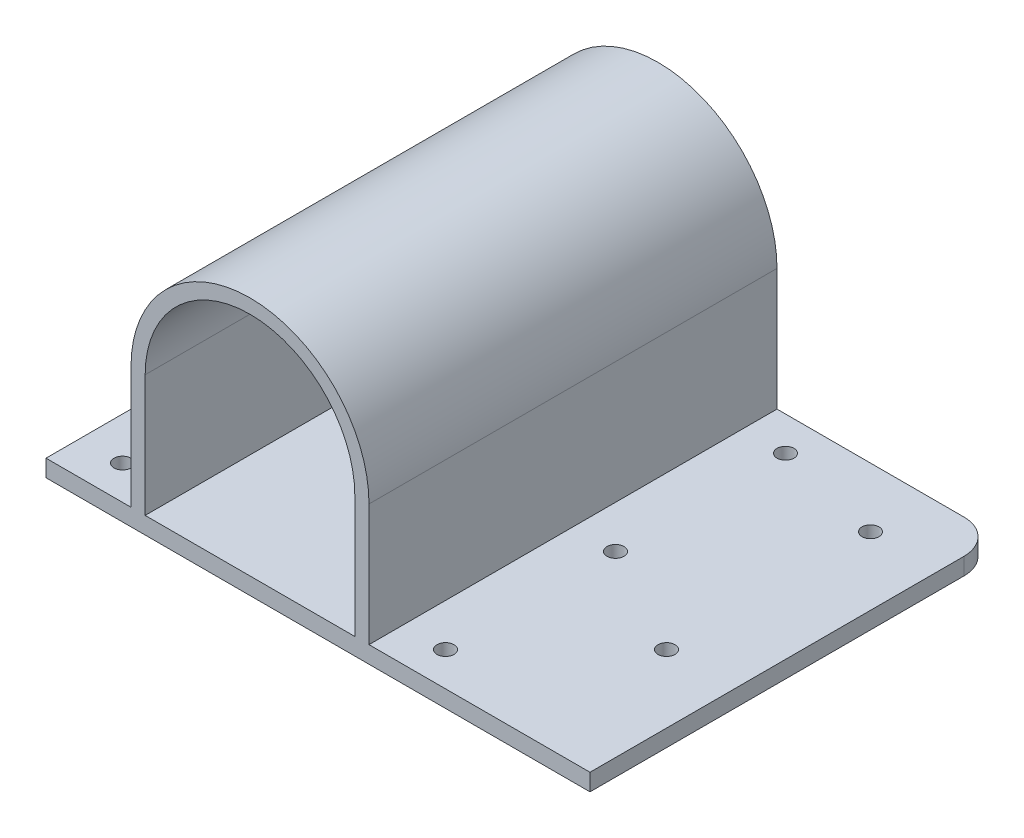
ISO-10303-21;
HEADER;
FILE_DESCRIPTION(('STEP AP214'),'2;1');
FILE_NAME('part.step','',(''),(''),'','','');
FILE_SCHEMA(('AUTOMOTIVE_DESIGN { 1 0 10303 214 1 1 1 1 }'));
ENDSEC;
DATA;
#1=APPLICATION_CONTEXT('core data for automotive mechanical design processes');
#2=APPLICATION_PROTOCOL_DEFINITION('international standard','automotive_design',2000,#1);
#3=PRODUCT_CONTEXT('',#1,'mechanical');
#4=PRODUCT('Part','Part','',(#3));
#5=PRODUCT_RELATED_PRODUCT_CATEGORY('part','',(#4));
#6=PRODUCT_DEFINITION_FORMATION('','',#4);
#7=PRODUCT_DEFINITION_CONTEXT('part definition',#1,'design');
#8=PRODUCT_DEFINITION('design','',#6,#7);
#9=PRODUCT_DEFINITION_SHAPE('','',#8);
#10=(LENGTH_UNIT() NAMED_UNIT(*) SI_UNIT(.MILLI.,.METRE.));
#11=(NAMED_UNIT(*) PLANE_ANGLE_UNIT() SI_UNIT($,.RADIAN.));
#12=(NAMED_UNIT(*) SI_UNIT($,.STERADIAN.) SOLID_ANGLE_UNIT());
#13=UNCERTAINTY_MEASURE_WITH_UNIT(LENGTH_MEASURE(1.E-05),#10,'distance_accuracy_value','');
#14=(GEOMETRIC_REPRESENTATION_CONTEXT(3) GLOBAL_UNCERTAINTY_ASSIGNED_CONTEXT((#13)) GLOBAL_UNIT_ASSIGNED_CONTEXT((#10,
#11,#12)) REPRESENTATION_CONTEXT('',''));
#15=CARTESIAN_POINT('',(0.,0.,0.));
#16=DIRECTION('',(0.,0.,1.));
#17=DIRECTION('',(1.,0.,0.));
#18=AXIS2_PLACEMENT_3D('',#15,#16,#17);
#19=CARTESIAN_POINT('',(0.,15.5,72.));
#20=DIRECTION('',(0.,0.,-1.));
#21=DIRECTION('',(-1.,0.,0.));
#22=AXIS2_PLACEMENT_3D('',#19,#20,#21);
#23=CYLINDRICAL_SURFACE('',#22,1.65);
#24=CARTESIAN_POINT('',(0.,15.5,0.));
#25=DIRECTION('',(0.,0.,1.));
#26=DIRECTION('',(1.,0.,0.));
#27=AXIS2_PLACEMENT_3D('',#24,#25,#26);
#28=CIRCLE('',#27,1.65);
#29=CARTESIAN_POINT('',(1.64999999999994,15.5,0.));
#30=VERTEX_POINT('',#29);
#31=EDGE_CURVE('E270',#30,#30,#28,.T.);
#32=ORIENTED_EDGE('',*,*,#31,.F.);
#33=EDGE_LOOP('',(#32));
#34=FACE_BOUND('',#33,.T.);
#35=CARTESIAN_POINT('',(0.,15.5,15.));
#36=DIRECTION('',(0.,0.,1.));
#37=DIRECTION('',(1.,0.,0.));
#38=AXIS2_PLACEMENT_3D('',#35,#36,#37);
#39=CIRCLE('',#38,1.65);
#40=CARTESIAN_POINT('',(1.64999999999994,15.5,15.));
#41=VERTEX_POINT('',#40);
#42=EDGE_CURVE('E249',#41,#41,#39,.T.);
#43=ORIENTED_EDGE('',*,*,#42,.T.);
#44=EDGE_LOOP('',(#43));
#45=FACE_BOUND('',#44,.T.);
#46=ADVANCED_FACE('F39',(#34,#45),#23,.F.);
#47=CARTESIAN_POINT('',(7.,0.,72.));
#48=DIRECTION('',(0.,0.,-1.));
#49=DIRECTION('',(-1.,0.,0.));
#50=AXIS2_PLACEMENT_3D('',#47,#48,#49);
#51=CYLINDRICAL_SURFACE('',#50,6.15);
#52=CARTESIAN_POINT('',(7.,0.,0.));
#53=DIRECTION('',(0.,0.,1.));
#54=DIRECTION('',(1.,0.,0.));
#55=AXIS2_PLACEMENT_3D('',#52,#53,#54);
#56=CIRCLE('',#55,6.15);
#57=CARTESIAN_POINT('',(13.15,0.,0.));
#58=VERTEX_POINT('',#57);
#59=EDGE_CURVE('E267',#58,#58,#56,.T.);
#60=ORIENTED_EDGE('',*,*,#59,.F.);
#61=EDGE_LOOP('',(#60));
#62=FACE_BOUND('',#61,.T.);
#63=CARTESIAN_POINT('',(7.,0.,15.));
#64=DIRECTION('',(0.,0.,1.));
#65=DIRECTION('',(1.,0.,0.));
#66=AXIS2_PLACEMENT_3D('',#63,#64,#65);
#67=CIRCLE('',#66,6.15);
#68=CARTESIAN_POINT('',(13.15,0.,15.));
#69=VERTEX_POINT('',#68);
#70=EDGE_CURVE('E246',#69,#69,#67,.T.);
#71=ORIENTED_EDGE('',*,*,#70,.T.);
#72=EDGE_LOOP('',(#71));
#73=FACE_BOUND('',#72,.T.);
#74=ADVANCED_FACE('F356',(#62,#73),#51,.F.);
#75=CARTESIAN_POINT('',(13.4233937586588,7.75000000000005,72.));
#76=DIRECTION('',(0.,0.,-1.));
#77=DIRECTION('',(-1.,0.,0.));
#78=AXIS2_PLACEMENT_3D('',#75,#76,#77);
#79=CYLINDRICAL_SURFACE('',#78,1.65);
#80=CARTESIAN_POINT('',(13.4233937586588,7.75000000000005,0.));
#81=DIRECTION('',(0.,0.,1.));
#82=DIRECTION('',(1.,0.,0.));
#83=AXIS2_PLACEMENT_3D('',#80,#81,#82);
#84=CIRCLE('',#83,1.65);
#85=CARTESIAN_POINT('',(15.0733937586588,7.75000000000005,0.));
#86=VERTEX_POINT('',#85);
#87=EDGE_CURVE('E264',#86,#86,#84,.T.);
#88=ORIENTED_EDGE('',*,*,#87,.F.);
#89=EDGE_LOOP('',(#88));
#90=FACE_BOUND('',#89,.T.);
#91=CARTESIAN_POINT('',(13.4233937586588,7.75000000000005,15.));
#92=DIRECTION('',(0.,0.,1.));
#93=DIRECTION('',(1.,0.,0.));
#94=AXIS2_PLACEMENT_3D('',#91,#92,#93);
#95=CIRCLE('',#94,1.65);
#96=CARTESIAN_POINT('',(15.0733937586588,7.75000000000005,15.));
#97=VERTEX_POINT('',#96);
#98=EDGE_CURVE('E243',#97,#97,#95,.T.);
#99=ORIENTED_EDGE('',*,*,#98,.T.);
#100=EDGE_LOOP('',(#99));
#101=FACE_BOUND('',#100,.T.);
#102=ADVANCED_FACE('F363',(#90,#101),#79,.F.);
#103=CARTESIAN_POINT('',(13.4233937586588,-7.74999999999995,72.));
#104=DIRECTION('',(0.,0.,-1.));
#105=DIRECTION('',(-1.,0.,0.));
#106=AXIS2_PLACEMENT_3D('',#103,#104,#105);
#107=CYLINDRICAL_SURFACE('',#106,1.65);
#108=CARTESIAN_POINT('',(13.4233937586588,-7.74999999999995,0.));
#109=DIRECTION('',(0.,0.,1.));
#110=DIRECTION('',(1.,0.,0.));
#111=AXIS2_PLACEMENT_3D('',#108,#109,#110);
#112=CIRCLE('',#111,1.65);
#113=CARTESIAN_POINT('',(15.0733937586588,-7.74999999999995,0.));
#114=VERTEX_POINT('',#113);
#115=EDGE_CURVE('E261',#114,#114,#112,.T.);
#116=ORIENTED_EDGE('',*,*,#115,.F.);
#117=EDGE_LOOP('',(#116));
#118=FACE_BOUND('',#117,.T.);
#119=CARTESIAN_POINT('',(13.4233937586588,-7.74999999999995,15.));
#120=DIRECTION('',(0.,0.,1.));
#121=DIRECTION('',(1.,0.,0.));
#122=AXIS2_PLACEMENT_3D('',#119,#120,#121);
#123=CIRCLE('',#122,1.65);
#124=CARTESIAN_POINT('',(15.0733937586588,-7.74999999999995,15.));
#125=VERTEX_POINT('',#124);
#126=EDGE_CURVE('E240',#125,#125,#123,.T.);
#127=ORIENTED_EDGE('',*,*,#126,.T.);
#128=EDGE_LOOP('',(#127));
#129=FACE_BOUND('',#128,.T.);
#130=ADVANCED_FACE('F444',(#118,#129),#107,.F.);
#131=CARTESIAN_POINT('',(0.,-15.5,72.));
#132=DIRECTION('',(0.,0.,-1.));
#133=DIRECTION('',(-1.,0.,0.));
#134=AXIS2_PLACEMENT_3D('',#131,#132,#133);
#135=CYLINDRICAL_SURFACE('',#134,1.65);
#136=CARTESIAN_POINT('',(0.,-15.5,0.));
#137=DIRECTION('',(0.,0.,1.));
#138=DIRECTION('',(1.,0.,0.));
#139=AXIS2_PLACEMENT_3D('',#136,#137,#138);
#140=CIRCLE('',#139,1.65);
#141=CARTESIAN_POINT('',(1.65000000000006,-15.5,0.));
#142=VERTEX_POINT('',#141);
#143=EDGE_CURVE('E258',#142,#142,#140,.T.);
#144=ORIENTED_EDGE('',*,*,#143,.F.);
#145=EDGE_LOOP('',(#144));
#146=FACE_BOUND('',#145,.T.);
#147=CARTESIAN_POINT('',(0.,-15.5,15.));
#148=DIRECTION('',(0.,0.,1.));
#149=DIRECTION('',(1.,0.,0.));
#150=AXIS2_PLACEMENT_3D('',#147,#148,#149);
#151=CIRCLE('',#150,1.65);
#152=CARTESIAN_POINT('',(1.65000000000006,-15.5,15.));
#153=VERTEX_POINT('',#152);
#154=EDGE_CURVE('E237',#153,#153,#151,.T.);
#155=ORIENTED_EDGE('',*,*,#154,.T.);
#156=EDGE_LOOP('',(#155));
#157=FACE_BOUND('',#156,.T.);
#158=ADVANCED_FACE('F435',(#146,#157),#135,.F.);
#159=CARTESIAN_POINT('',(-13.4233937586588,-7.75000000000006,72.));
#160=DIRECTION('',(0.,0.,-1.));
#161=DIRECTION('',(-1.,0.,0.));
#162=AXIS2_PLACEMENT_3D('',#159,#160,#161);
#163=CYLINDRICAL_SURFACE('',#162,1.65);
#164=CARTESIAN_POINT('',(-13.4233937586588,-7.75000000000006,0.));
#165=DIRECTION('',(0.,0.,1.));
#166=DIRECTION('',(1.,0.,0.));
#167=AXIS2_PLACEMENT_3D('',#164,#165,#166);
#168=CIRCLE('',#167,1.65);
#169=CARTESIAN_POINT('',(-11.7733937586588,-7.75000000000006,0.));
#170=VERTEX_POINT('',#169);
#171=EDGE_CURVE('E255',#170,#170,#168,.T.);
#172=ORIENTED_EDGE('',*,*,#171,.F.);
#173=EDGE_LOOP('',(#172));
#174=FACE_BOUND('',#173,.T.);
#175=CARTESIAN_POINT('',(-13.4233937586588,-7.75000000000006,15.));
#176=DIRECTION('',(0.,0.,1.));
#177=DIRECTION('',(1.,0.,0.));
#178=AXIS2_PLACEMENT_3D('',#175,#176,#177);
#179=CIRCLE('',#178,1.65);
#180=CARTESIAN_POINT('',(-11.7733937586588,-7.75000000000006,15.));
#181=VERTEX_POINT('',#180);
#182=EDGE_CURVE('E234',#181,#181,#179,.T.);
#183=ORIENTED_EDGE('',*,*,#182,.T.);
#184=EDGE_LOOP('',(#183));
#185=FACE_BOUND('',#184,.T.);
#186=ADVANCED_FACE('F426',(#174,#185),#163,.F.);
#187=CARTESIAN_POINT('',(-13.4233937586588,7.74999999999995,72.));
#188=DIRECTION('',(0.,0.,-1.));
#189=DIRECTION('',(-1.,0.,0.));
#190=AXIS2_PLACEMENT_3D('',#187,#188,#189);
#191=CYLINDRICAL_SURFACE('',#190,1.65);
#192=CARTESIAN_POINT('',(-13.4233937586588,7.74999999999995,0.));
#193=DIRECTION('',(0.,0.,1.));
#194=DIRECTION('',(1.,0.,0.));
#195=AXIS2_PLACEMENT_3D('',#192,#193,#194);
#196=CIRCLE('',#195,1.65);
#197=CARTESIAN_POINT('',(-11.7733937586588,7.74999999999995,0.));
#198=VERTEX_POINT('',#197);
#199=EDGE_CURVE('E252',#198,#198,#196,.T.);
#200=ORIENTED_EDGE('',*,*,#199,.F.);
#201=EDGE_LOOP('',(#200));
#202=FACE_BOUND('',#201,.T.);
#203=CARTESIAN_POINT('',(-13.4233937586588,7.74999999999995,15.));
#204=DIRECTION('',(0.,0.,1.));
#205=DIRECTION('',(1.,0.,0.));
#206=AXIS2_PLACEMENT_3D('',#203,#204,#205);
#207=CIRCLE('',#206,1.65);
#208=CARTESIAN_POINT('',(-11.7733937586588,7.74999999999995,15.));
#209=VERTEX_POINT('',#208);
#210=EDGE_CURVE('E227',#209,#209,#207,.T.);
#211=ORIENTED_EDGE('',*,*,#210,.T.);
#212=EDGE_LOOP('',(#211));
#213=FACE_BOUND('',#212,.T.);
#214=ADVANCED_FACE('F372',(#202,#213),#191,.F.);
#215=CARTESIAN_POINT('',(0.,0.,72.));
#216=DIRECTION('',(0.,0.,1.));
#217=DIRECTION('',(1.,0.,0.));
#218=AXIS2_PLACEMENT_3D('',#215,#216,#217);
#219=PLANE('',#218);
#220=CARTESIAN_POINT('',(0.,0.,72.));
#221=DIRECTION('',(0.,0.,1.));
#222=DIRECTION('',(1.,0.,0.));
#223=AXIS2_PLACEMENT_3D('',#220,#221,#222);
#224=CIRCLE('',#223,18.5);
#225=CARTESIAN_POINT('',(18.5,0.,72.));
#226=VERTEX_POINT('',#225);
#227=CARTESIAN_POINT('',(-18.5,0.,72.));
#228=VERTEX_POINT('',#227);
#229=EDGE_CURVE('E199',#226,#228,#224,.T.);
#230=ORIENTED_EDGE('',*,*,#229,.F.);
#231=DIRECTION('',(0.,1.,0.));
#232=VECTOR('',#231,1.);
#233=CARTESIAN_POINT('',(18.5,-21.5,72.));
#234=LINE('',#233,#232);
#235=CARTESIAN_POINT('',(18.5,-21.5,72.));
#236=VERTEX_POINT('',#235);
#237=EDGE_CURVE('E206',#236,#226,#234,.T.);
#238=ORIENTED_EDGE('',*,*,#237,.F.);
#239=DIRECTION('',(1.,0.,0.));
#240=VECTOR('',#239,1.);
#241=CARTESIAN_POINT('',(-18.5,-21.5,72.));
#242=LINE('',#241,#240);
#243=CARTESIAN_POINT('',(-18.5,-21.5,72.));
#244=VERTEX_POINT('',#243);
#245=EDGE_CURVE('E220',#244,#236,#242,.T.);
#246=ORIENTED_EDGE('',*,*,#245,.F.);
#247=DIRECTION('',(0.,-1.,0.));
#248=VECTOR('',#247,1.);
#249=CARTESIAN_POINT('',(-18.5,0.,72.));
#250=LINE('',#249,#248);
#251=EDGE_CURVE('E217',#228,#244,#250,.T.);
#252=ORIENTED_EDGE('',*,*,#251,.F.);
#253=EDGE_LOOP('',(#230,#238,#246,#252));
#254=FACE_BOUND('',#253,.T.);
#255=CARTESIAN_POINT('',(0.,0.,72.));
#256=DIRECTION('',(0.,0.,1.));
#257=DIRECTION('',(1.,0.,0.));
#258=AXIS2_PLACEMENT_3D('',#255,#256,#257);
#259=CIRCLE('',#258,21.);
#260=CARTESIAN_POINT('',(21.,0.,72.));
#261=VERTEX_POINT('',#260);
#262=CARTESIAN_POINT('',(-21.,0.,72.));
#263=VERTEX_POINT('',#262);
#264=EDGE_CURVE('E274',#261,#263,#259,.T.);
#265=ORIENTED_EDGE('',*,*,#264,.T.);
#266=DIRECTION('',(0.,-1.,0.));
#267=VECTOR('',#266,1.);
#268=CARTESIAN_POINT('',(-21.,0.,72.));
#269=LINE('',#268,#267);
#270=CARTESIAN_POINT('',(-21.,-21.5,72.));
#271=VERTEX_POINT('',#270);
#272=EDGE_CURVE('E276',#263,#271,#269,.T.);
#273=ORIENTED_EDGE('',*,*,#272,.T.);
#274=DIRECTION('',(-1.,0.,0.));
#275=VECTOR('',#274,1.);
#276=CARTESIAN_POINT('',(-21.,-21.5,72.));
#277=LINE('',#276,#275);
#278=CARTESIAN_POINT('',(-36.,-21.5,72.));
#279=VERTEX_POINT('',#278);
#280=EDGE_CURVE('E279',#271,#279,#277,.T.);
#281=ORIENTED_EDGE('',*,*,#280,.T.);
#282=DIRECTION('',(0.,-1.,0.));
#283=VECTOR('',#282,1.);
#284=CARTESIAN_POINT('',(-36.,-21.5,72.));
#285=LINE('',#284,#283);
#286=CARTESIAN_POINT('',(-36.,-24.5,72.));
#287=VERTEX_POINT('',#286);
#288=EDGE_CURVE('E140',#279,#287,#285,.T.);
#289=ORIENTED_EDGE('',*,*,#288,.T.);
#290=DIRECTION('',(1.,0.,0.));
#291=VECTOR('',#290,1.);
#292=CARTESIAN_POINT('',(-36.,-24.5,72.));
#293=LINE('',#292,#291);
#294=CARTESIAN_POINT('',(60.,-24.5,72.));
#295=VERTEX_POINT('',#294);
#296=EDGE_CURVE('E133',#287,#295,#293,.T.);
#297=ORIENTED_EDGE('',*,*,#296,.T.);
#298=DIRECTION('',(0.,1.,0.));
#299=VECTOR('',#298,1.);
#300=CARTESIAN_POINT('',(60.,-24.5,72.));
#301=LINE('',#300,#299);
#302=CARTESIAN_POINT('',(60.,-21.5,72.));
#303=VERTEX_POINT('',#302);
#304=EDGE_CURVE('E137',#295,#303,#301,.T.);
#305=ORIENTED_EDGE('',*,*,#304,.T.);
#306=DIRECTION('',(-1.,0.,0.));
#307=VECTOR('',#306,1.);
#308=CARTESIAN_POINT('',(36.,-21.5,72.));
#309=LINE('',#308,#307);
#310=CARTESIAN_POINT('',(21.,-21.5,72.));
#311=VERTEX_POINT('',#310);
#312=EDGE_CURVE('E145',#303,#311,#309,.T.);
#313=ORIENTED_EDGE('',*,*,#312,.T.);
#314=DIRECTION('',(0.,1.,0.));
#315=VECTOR('',#314,1.);
#316=CARTESIAN_POINT('',(21.,-21.5,72.));
#317=LINE('',#316,#315);
#318=EDGE_CURVE('E283',#311,#261,#317,.T.);
#319=ORIENTED_EDGE('',*,*,#318,.T.);
#320=EDGE_LOOP('',(#265,#273,#281,#289,#297,#305,#313,#319));
#321=FACE_BOUND('',#320,.T.);
#322=ADVANCED_FACE('F136',(#254,#321),#219,.T.);
#323=CARTESIAN_POINT('',(0.,0.,0.));
#324=DIRECTION('',(0.,0.,1.));
#325=DIRECTION('',(1.,0.,0.));
#326=AXIS2_PLACEMENT_3D('',#323,#324,#325);
#327=PLANE('',#326);
#328=DIRECTION('',(-1.,0.,0.));
#329=VECTOR('',#328,1.);
#330=CARTESIAN_POINT('',(36.,-21.5,0.));
#331=LINE('',#330,#329);
#332=CARTESIAN_POINT('',(54.,-21.5,0.));
#333=VERTEX_POINT('',#332);
#334=CARTESIAN_POINT('',(21.,-21.5,0.));
#335=VERTEX_POINT('',#334);
#336=EDGE_CURVE('E296',#333,#335,#331,.T.);
#337=ORIENTED_EDGE('',*,*,#336,.F.);
#338=DIRECTION('',(0.,1.,0.));
#339=VECTOR('',#338,1.);
#340=CARTESIAN_POINT('',(54.,-24.5,0.));
#341=LINE('',#340,#339);
#342=CARTESIAN_POINT('',(54.,-24.5,0.));
#343=VERTEX_POINT('',#342);
#344=EDGE_CURVE('E47',#333,#343,#341,.F.);
#345=ORIENTED_EDGE('',*,*,#344,.T.);
#346=DIRECTION('',(1.,0.,0.));
#347=VECTOR('',#346,1.);
#348=CARTESIAN_POINT('',(-36.,-24.5,0.));
#349=LINE('',#348,#347);
#350=CARTESIAN_POINT('',(-36.,-24.5,0.));
#351=VERTEX_POINT('',#350);
#352=EDGE_CURVE('E294',#351,#343,#349,.T.);
#353=ORIENTED_EDGE('',*,*,#352,.F.);
#354=DIRECTION('',(0.,-1.,0.));
#355=VECTOR('',#354,1.);
#356=CARTESIAN_POINT('',(-36.,-21.5,0.));
#357=LINE('',#356,#355);
#358=CARTESIAN_POINT('',(-36.,-21.5,0.));
#359=VERTEX_POINT('',#358);
#360=EDGE_CURVE('E292',#359,#351,#357,.T.);
#361=ORIENTED_EDGE('',*,*,#360,.F.);
#362=DIRECTION('',(-1.,0.,0.));
#363=VECTOR('',#362,1.);
#364=CARTESIAN_POINT('',(-21.,-21.5,0.));
#365=LINE('',#364,#363);
#366=CARTESIAN_POINT('',(-21.,-21.5,0.));
#367=VERTEX_POINT('',#366);
#368=EDGE_CURVE('E290',#367,#359,#365,.T.);
#369=ORIENTED_EDGE('',*,*,#368,.F.);
#370=DIRECTION('',(0.,-1.,0.));
#371=VECTOR('',#370,1.);
#372=CARTESIAN_POINT('',(-21.,0.,0.));
#373=LINE('',#372,#371);
#374=CARTESIAN_POINT('',(-21.,0.,0.));
#375=VERTEX_POINT('',#374);
#376=EDGE_CURVE('E288',#375,#367,#373,.T.);
#377=ORIENTED_EDGE('',*,*,#376,.F.);
#378=CARTESIAN_POINT('',(0.,0.,0.));
#379=DIRECTION('',(0.,0.,1.));
#380=DIRECTION('',(1.,0.,0.));
#381=AXIS2_PLACEMENT_3D('',#378,#379,#380);
#382=CIRCLE('',#381,21.);
#383=CARTESIAN_POINT('',(21.,0.,0.));
#384=VERTEX_POINT('',#383);
#385=EDGE_CURVE('E273',#384,#375,#382,.T.);
#386=ORIENTED_EDGE('',*,*,#385,.F.);
#387=DIRECTION('',(0.,1.,0.));
#388=VECTOR('',#387,1.);
#389=CARTESIAN_POINT('',(21.,-21.5,0.));
#390=LINE('',#389,#388);
#391=EDGE_CURVE('E277',#335,#384,#390,.T.);
#392=ORIENTED_EDGE('',*,*,#391,.F.);
#393=EDGE_LOOP('',(#337,#345,#353,#361,#369,#377,#386,#392));
#394=FACE_BOUND('',#393,.T.);
#395=ORIENTED_EDGE('',*,*,#31,.T.);
#396=EDGE_LOOP('',(#395));
#397=FACE_BOUND('',#396,.T.);
#398=ORIENTED_EDGE('',*,*,#59,.T.);
#399=EDGE_LOOP('',(#398));
#400=FACE_BOUND('',#399,.T.);
#401=ORIENTED_EDGE('',*,*,#87,.T.);
#402=EDGE_LOOP('',(#401));
#403=FACE_BOUND('',#402,.T.);
#404=ORIENTED_EDGE('',*,*,#115,.T.);
#405=EDGE_LOOP('',(#404));
#406=FACE_BOUND('',#405,.T.);
#407=ORIENTED_EDGE('',*,*,#143,.T.);
#408=EDGE_LOOP('',(#407));
#409=FACE_BOUND('',#408,.T.);
#410=ORIENTED_EDGE('',*,*,#171,.T.);
#411=EDGE_LOOP('',(#410));
#412=FACE_BOUND('',#411,.T.);
#413=ORIENTED_EDGE('',*,*,#199,.T.);
#414=EDGE_LOOP('',(#413));
#415=FACE_BOUND('',#414,.T.);
#416=ADVANCED_FACE('F344',(#394,#397,#400,#403,#406,#409,#412,#415),#327,.F.);
#417=CARTESIAN_POINT('',(0.,0.,72.));
#418=DIRECTION('',(0.,0.,-1.));
#419=DIRECTION('',(-1.,0.,0.));
#420=AXIS2_PLACEMENT_3D('',#417,#418,#419);
#421=CYLINDRICAL_SURFACE('',#420,21.);
#422=ORIENTED_EDGE('',*,*,#385,.T.);
#423=DIRECTION('',(0.,0.,-1.));
#424=VECTOR('',#423,1.);
#425=CARTESIAN_POINT('',(-21.,0.,72.));
#426=LINE('',#425,#424);
#427=EDGE_CURVE('E312',#263,#375,#426,.T.);
#428=ORIENTED_EDGE('',*,*,#427,.F.);
#429=ORIENTED_EDGE('',*,*,#264,.F.);
#430=DIRECTION('',(0.,0.,-1.));
#431=VECTOR('',#430,1.);
#432=CARTESIAN_POINT('',(21.,0.,72.));
#433=LINE('',#432,#431);
#434=EDGE_CURVE('E285',#261,#384,#433,.T.);
#435=ORIENTED_EDGE('',*,*,#434,.T.);
#436=EDGE_LOOP('',(#422,#428,#429,#435));
#437=FACE_BOUND('',#436,.T.);
#438=ADVANCED_FACE('F332',(#437),#421,.T.);
#439=CARTESIAN_POINT('',(-21.,0.,72.));
#440=DIRECTION('',(1.,0.,0.));
#441=DIRECTION('',(0.,1.,0.));
#442=AXIS2_PLACEMENT_3D('',#439,#440,#441);
#443=PLANE('',#442);
#444=ORIENTED_EDGE('',*,*,#376,.T.);
#445=DIRECTION('',(0.,0.,-1.));
#446=VECTOR('',#445,1.);
#447=CARTESIAN_POINT('',(-21.,-21.5,72.));
#448=LINE('',#447,#446);
#449=EDGE_CURVE('E309',#271,#367,#448,.T.);
#450=ORIENTED_EDGE('',*,*,#449,.F.);
#451=ORIENTED_EDGE('',*,*,#272,.F.);
#452=ORIENTED_EDGE('',*,*,#427,.T.);
#453=EDGE_LOOP('',(#444,#450,#451,#452));
#454=FACE_BOUND('',#453,.T.);
#455=ADVANCED_FACE('F334',(#454),#443,.F.);
#456=CARTESIAN_POINT('',(-21.,-21.5,72.));
#457=DIRECTION('',(0.,-1.,0.));
#458=DIRECTION('',(0.,0.,-1.));
#459=AXIS2_PLACEMENT_3D('',#456,#457,#458);
#460=PLANE('',#459);
#461=CARTESIAN_POINT('',(-28.5,-21.5,6.));
#462=DIRECTION('',(0.,1.,0.));
#463=DIRECTION('',(0.,0.,1.));
#464=AXIS2_PLACEMENT_3D('',#461,#462,#463);
#465=CIRCLE('',#464,1.5);
#466=CARTESIAN_POINT('',(-28.5,-21.5,7.5));
#467=VERTEX_POINT('',#466);
#468=EDGE_CURVE('E172',#467,#467,#465,.T.);
#469=ORIENTED_EDGE('',*,*,#468,.F.);
#470=EDGE_LOOP('',(#469));
#471=FACE_BOUND('',#470,.T.);
#472=CARTESIAN_POINT('',(-28.5,-21.5,66.));
#473=DIRECTION('',(0.,1.,0.));
#474=DIRECTION('',(0.,0.,1.));
#475=AXIS2_PLACEMENT_3D('',#472,#473,#474);
#476=CIRCLE('',#475,1.5);
#477=CARTESIAN_POINT('',(-28.5,-21.5,67.5));
#478=VERTEX_POINT('',#477);
#479=EDGE_CURVE('E179',#478,#478,#476,.T.);
#480=ORIENTED_EDGE('',*,*,#479,.F.);
#481=EDGE_LOOP('',(#480));
#482=FACE_BOUND('',#481,.T.);
#483=CARTESIAN_POINT('',(-28.5,-21.5,36.));
#484=DIRECTION('',(0.,1.,0.));
#485=DIRECTION('',(0.,0.,1.));
#486=AXIS2_PLACEMENT_3D('',#483,#484,#485);
#487=CIRCLE('',#486,1.5);
#488=CARTESIAN_POINT('',(-28.5,-21.5,37.5));
#489=VERTEX_POINT('',#488);
#490=EDGE_CURVE('E175',#489,#489,#487,.T.);
#491=ORIENTED_EDGE('',*,*,#490,.F.);
#492=EDGE_LOOP('',(#491));
#493=FACE_BOUND('',#492,.T.);
#494=ORIENTED_EDGE('',*,*,#368,.T.);
#495=DIRECTION('',(0.,0.,-1.));
#496=VECTOR('',#495,1.);
#497=CARTESIAN_POINT('',(-36.,-21.5,72.));
#498=LINE('',#497,#496);
#499=EDGE_CURVE('E306',#279,#359,#498,.T.);
#500=ORIENTED_EDGE('',*,*,#499,.F.);
#501=ORIENTED_EDGE('',*,*,#280,.F.);
#502=ORIENTED_EDGE('',*,*,#449,.T.);
#503=EDGE_LOOP('',(#494,#500,#501,#502));
#504=FACE_BOUND('',#503,.T.);
#505=ADVANCED_FACE('F339',(#471,#482,#493,#504),#460,.F.);
#506=CARTESIAN_POINT('',(-36.,-21.5,72.));
#507=DIRECTION('',(1.,0.,0.));
#508=DIRECTION('',(0.,0.,-1.));
#509=AXIS2_PLACEMENT_3D('',#506,#507,#508);
#510=PLANE('',#509);
#511=ORIENTED_EDGE('',*,*,#360,.T.);
#512=DIRECTION('',(0.,0.,-1.));
#513=VECTOR('',#512,1.);
#514=CARTESIAN_POINT('',(-36.,-24.5,72.));
#515=LINE('',#514,#513);
#516=EDGE_CURVE('E304',#287,#351,#515,.T.);
#517=ORIENTED_EDGE('',*,*,#516,.F.);
#518=ORIENTED_EDGE('',*,*,#288,.F.);
#519=ORIENTED_EDGE('',*,*,#499,.T.);
#520=EDGE_LOOP('',(#511,#517,#518,#519));
#521=FACE_BOUND('',#520,.T.);
#522=ADVANCED_FACE('F343',(#521),#510,.F.);
#523=CARTESIAN_POINT('',(-36.,-24.5,72.));
#524=DIRECTION('',(0.,1.,0.));
#525=DIRECTION('',(0.,0.,1.));
#526=AXIS2_PLACEMENT_3D('',#523,#524,#525);
#527=PLANE('',#526);
#528=CARTESIAN_POINT('',(-28.5,-24.5,6.));
#529=DIRECTION('',(0.,1.,0.));
#530=DIRECTION('',(0.,0.,1.));
#531=AXIS2_PLACEMENT_3D('',#528,#529,#530);
#532=CIRCLE('',#531,1.5);
#533=CARTESIAN_POINT('',(-28.5,-24.5,7.5));
#534=VERTEX_POINT('',#533);
#535=EDGE_CURVE('E176',#534,#534,#532,.T.);
#536=ORIENTED_EDGE('',*,*,#535,.T.);
#537=EDGE_LOOP('',(#536));
#538=FACE_BOUND('',#537,.T.);
#539=CARTESIAN_POINT('',(-28.5,-24.5,66.));
#540=DIRECTION('',(0.,1.,0.));
#541=DIRECTION('',(0.,0.,1.));
#542=AXIS2_PLACEMENT_3D('',#539,#540,#541);
#543=CIRCLE('',#542,1.5);
#544=CARTESIAN_POINT('',(-28.5,-24.5,67.5));
#545=VERTEX_POINT('',#544);
#546=EDGE_CURVE('E182',#545,#545,#543,.T.);
#547=ORIENTED_EDGE('',*,*,#546,.T.);
#548=EDGE_LOOP('',(#547));
#549=FACE_BOUND('',#548,.T.);
#550=CARTESIAN_POINT('',(28.5,-24.5,66.));
#551=DIRECTION('',(0.,1.,0.));
#552=DIRECTION('',(0.,0.,-1.));
#553=AXIS2_PLACEMENT_3D('',#550,#551,#552);
#554=CIRCLE('',#553,1.5);
#555=CARTESIAN_POINT('',(28.5,-24.5,64.5));
#556=VERTEX_POINT('',#555);
#557=EDGE_CURVE('E188',#556,#556,#554,.T.);
#558=ORIENTED_EDGE('',*,*,#557,.T.);
#559=EDGE_LOOP('',(#558));
#560=FACE_BOUND('',#559,.T.);
#561=CARTESIAN_POINT('',(28.5,-24.5,5.99999999999999));
#562=DIRECTION('',(0.,1.,0.));
#563=DIRECTION('',(0.,0.,-1.));
#564=AXIS2_PLACEMENT_3D('',#561,#562,#563);
#565=CIRCLE('',#564,1.5);
#566=CARTESIAN_POINT('',(28.5,-24.5,4.49999999999999));
#567=VERTEX_POINT('',#566);
#568=EDGE_CURVE('E169',#567,#567,#565,.T.);
#569=ORIENTED_EDGE('',*,*,#568,.T.);
#570=EDGE_LOOP('',(#569));
#571=FACE_BOUND('',#570,.T.);
#572=CARTESIAN_POINT('',(28.5,-24.5,36.));
#573=DIRECTION('',(0.,1.,0.));
#574=DIRECTION('',(0.,0.,-1.));
#575=AXIS2_PLACEMENT_3D('',#572,#573,#574);
#576=CIRCLE('',#575,1.5);
#577=CARTESIAN_POINT('',(28.5,-24.5,34.5));
#578=VERTEX_POINT('',#577);
#579=EDGE_CURVE('E154',#578,#578,#576,.T.);
#580=ORIENTED_EDGE('',*,*,#579,.T.);
#581=EDGE_LOOP('',(#580));
#582=FACE_BOUND('',#581,.T.);
#583=CARTESIAN_POINT('',(-28.5,-24.5,36.));
#584=DIRECTION('',(0.,1.,0.));
#585=DIRECTION('',(0.,0.,1.));
#586=AXIS2_PLACEMENT_3D('',#583,#584,#585);
#587=CIRCLE('',#586,1.5);
#588=CARTESIAN_POINT('',(-28.5,-24.5,37.5));
#589=VERTEX_POINT('',#588);
#590=EDGE_CURVE('E196',#589,#589,#587,.T.);
#591=ORIENTED_EDGE('',*,*,#590,.T.);
#592=EDGE_LOOP('',(#591));
#593=FACE_BOUND('',#592,.T.);
#594=ORIENTED_EDGE('',*,*,#352,.T.);
#595=CARTESIAN_POINT('',(54.,-24.5,6.));
#596=DIRECTION('',(0.,1.,0.));
#597=DIRECTION('',(0.,0.,1.));
#598=AXIS2_PLACEMENT_3D('',#595,#596,#597);
#599=CIRCLE('',#598,6.);
#600=CARTESIAN_POINT('',(60.,-24.5,6.));
#601=VERTEX_POINT('',#600);
#602=EDGE_CURVE('E11',#343,#601,#599,.F.);
#603=ORIENTED_EDGE('',*,*,#602,.T.);
#604=DIRECTION('',(0.,0.,-1.));
#605=VECTOR('',#604,1.);
#606=CARTESIAN_POINT('',(60.,-24.5,0.));
#607=LINE('',#606,#605);
#608=EDGE_CURVE('E151',#295,#601,#607,.T.);
#609=ORIENTED_EDGE('',*,*,#608,.F.);
#610=ORIENTED_EDGE('',*,*,#296,.F.);
#611=ORIENTED_EDGE('',*,*,#516,.T.);
#612=EDGE_LOOP('',(#594,#603,#609,#610,#611));
#613=FACE_BOUND('',#612,.T.);
#614=CARTESIAN_POINT('',(48.,-24.5,46.5));
#615=DIRECTION('',(0.,1.,0.));
#616=DIRECTION('',(0.,0.,1.));
#617=AXIS2_PLACEMENT_3D('',#614,#615,#616);
#618=CIRCLE('',#617,1.5);
#619=CARTESIAN_POINT('',(48.,-24.5,48.));
#620=VERTEX_POINT('',#619);
#621=EDGE_CURVE('E637',#620,#620,#618,.T.);
#622=ORIENTED_EDGE('',*,*,#621,.T.);
#623=EDGE_LOOP('',(#622));
#624=FACE_BOUND('',#623,.T.);
#625=CARTESIAN_POINT('',(48.,-24.5,10.5));
#626=DIRECTION('',(0.,1.,0.));
#627=DIRECTION('',(0.,0.,1.));
#628=AXIS2_PLACEMENT_3D('',#625,#626,#627);
#629=CIRCLE('',#628,1.5);
#630=CARTESIAN_POINT('',(48.,-24.5,12.));
#631=VERTEX_POINT('',#630);
#632=EDGE_CURVE('E160',#631,#631,#629,.T.);
#633=ORIENTED_EDGE('',*,*,#632,.T.);
#634=EDGE_LOOP('',(#633));
#635=FACE_BOUND('',#634,.T.);
#636=ADVANCED_FACE('F156',(#538,#549,#560,#571,#582,#593,#613,#624,#635),#527,.F.);
#637=CARTESIAN_POINT('',(36.,-21.5,72.));
#638=DIRECTION('',(0.,-1.,0.));
#639=DIRECTION('',(0.,0.,-1.));
#640=AXIS2_PLACEMENT_3D('',#637,#638,#639);
#641=PLANE('',#640);
#642=CARTESIAN_POINT('',(28.5,-21.5,66.));
#643=DIRECTION('',(0.,1.,0.));
#644=DIRECTION('',(0.,0.,-1.));
#645=AXIS2_PLACEMENT_3D('',#642,#643,#644);
#646=CIRCLE('',#645,1.5);
#647=CARTESIAN_POINT('',(28.5,-21.5,64.5));
#648=VERTEX_POINT('',#647);
#649=EDGE_CURVE('E185',#648,#648,#646,.T.);
#650=ORIENTED_EDGE('',*,*,#649,.F.);
#651=EDGE_LOOP('',(#650));
#652=FACE_BOUND('',#651,.T.);
#653=CARTESIAN_POINT('',(28.5,-21.5,5.99999999999999));
#654=DIRECTION('',(0.,1.,0.));
#655=DIRECTION('',(0.,0.,-1.));
#656=AXIS2_PLACEMENT_3D('',#653,#654,#655);
#657=CIRCLE('',#656,1.5);
#658=CARTESIAN_POINT('',(28.5,-21.5,4.49999999999999));
#659=VERTEX_POINT('',#658);
#660=EDGE_CURVE('E191',#659,#659,#657,.T.);
#661=ORIENTED_EDGE('',*,*,#660,.F.);
#662=EDGE_LOOP('',(#661));
#663=FACE_BOUND('',#662,.T.);
#664=CARTESIAN_POINT('',(28.5,-21.5,36.));
#665=DIRECTION('',(0.,1.,0.));
#666=DIRECTION('',(0.,0.,-1.));
#667=AXIS2_PLACEMENT_3D('',#664,#665,#666);
#668=CIRCLE('',#667,1.5);
#669=CARTESIAN_POINT('',(28.5,-21.5,34.5));
#670=VERTEX_POINT('',#669);
#671=EDGE_CURVE('E166',#670,#670,#668,.T.);
#672=ORIENTED_EDGE('',*,*,#671,.F.);
#673=EDGE_LOOP('',(#672));
#674=FACE_BOUND('',#673,.T.);
#675=DIRECTION('',(0.,0.,-1.));
#676=VECTOR('',#675,1.);
#677=CARTESIAN_POINT('',(60.,-21.5,0.));
#678=LINE('',#677,#676);
#679=CARTESIAN_POINT('',(60.,-21.5,6.));
#680=VERTEX_POINT('',#679);
#681=EDGE_CURVE('E153',#303,#680,#678,.T.);
#682=ORIENTED_EDGE('',*,*,#681,.T.);
#683=CARTESIAN_POINT('',(54.,-21.5,6.));
#684=DIRECTION('',(0.,-1.,0.));
#685=DIRECTION('',(0.,0.,-1.));
#686=AXIS2_PLACEMENT_3D('',#683,#684,#685);
#687=CIRCLE('',#686,6.);
#688=EDGE_CURVE('E61',#680,#333,#687,.F.);
#689=ORIENTED_EDGE('',*,*,#688,.T.);
#690=ORIENTED_EDGE('',*,*,#336,.T.);
#691=DIRECTION('',(0.,0.,-1.));
#692=VECTOR('',#691,1.);
#693=CARTESIAN_POINT('',(21.,-21.5,72.));
#694=LINE('',#693,#692);
#695=EDGE_CURVE('E301',#311,#335,#694,.T.);
#696=ORIENTED_EDGE('',*,*,#695,.F.);
#697=ORIENTED_EDGE('',*,*,#312,.F.);
#698=EDGE_LOOP('',(#682,#689,#690,#696,#697));
#699=FACE_BOUND('',#698,.T.);
#700=CARTESIAN_POINT('',(48.,-21.5,46.5));
#701=DIRECTION('',(0.,1.,0.));
#702=DIRECTION('',(0.,0.,1.));
#703=AXIS2_PLACEMENT_3D('',#700,#701,#702);
#704=CIRCLE('',#703,1.5);
#705=CARTESIAN_POINT('',(48.,-21.5,48.));
#706=VERTEX_POINT('',#705);
#707=EDGE_CURVE('E639',#706,#706,#704,.T.);
#708=ORIENTED_EDGE('',*,*,#707,.F.);
#709=EDGE_LOOP('',(#708));
#710=FACE_BOUND('',#709,.T.);
#711=CARTESIAN_POINT('',(48.,-21.5,10.5));
#712=DIRECTION('',(0.,1.,0.));
#713=DIRECTION('',(0.,0.,1.));
#714=AXIS2_PLACEMENT_3D('',#711,#712,#713);
#715=CIRCLE('',#714,1.5);
#716=CARTESIAN_POINT('',(48.,-21.5,12.));
#717=VERTEX_POINT('',#716);
#718=EDGE_CURVE('E163',#717,#717,#715,.T.);
#719=ORIENTED_EDGE('',*,*,#718,.F.);
#720=EDGE_LOOP('',(#719));
#721=FACE_BOUND('',#720,.T.);
#722=ADVANCED_FACE('F320',(#652,#663,#674,#699,#710,#721),#641,.F.);
#723=CARTESIAN_POINT('',(21.,-21.5,72.));
#724=DIRECTION('',(-1.,0.,0.));
#725=DIRECTION('',(0.,-1.,0.));
#726=AXIS2_PLACEMENT_3D('',#723,#724,#725);
#727=PLANE('',#726);
#728=ORIENTED_EDGE('',*,*,#391,.T.);
#729=ORIENTED_EDGE('',*,*,#434,.F.);
#730=ORIENTED_EDGE('',*,*,#318,.F.);
#731=ORIENTED_EDGE('',*,*,#695,.T.);
#732=EDGE_LOOP('',(#728,#729,#730,#731));
#733=FACE_BOUND('',#732,.T.);
#734=ADVANCED_FACE('F328',(#733),#727,.F.);
#735=CARTESIAN_POINT('',(0.,0.,15.));
#736=DIRECTION('',(0.,0.,1.));
#737=DIRECTION('',(1.,0.,0.));
#738=AXIS2_PLACEMENT_3D('',#735,#736,#737);
#739=CYLINDRICAL_SURFACE('',#738,18.5);
#740=ORIENTED_EDGE('',*,*,#229,.T.);
#741=DIRECTION('',(0.,0.,1.));
#742=VECTOR('',#741,1.);
#743=CARTESIAN_POINT('',(-18.5,0.,15.));
#744=LINE('',#743,#742);
#745=CARTESIAN_POINT('',(-18.5,0.,15.));
#746=VERTEX_POINT('',#745);
#747=EDGE_CURVE('E215',#746,#228,#744,.T.);
#748=ORIENTED_EDGE('',*,*,#747,.F.);
#749=CARTESIAN_POINT('',(0.,0.,15.));
#750=DIRECTION('',(0.,0.,1.));
#751=DIRECTION('',(1.,0.,0.));
#752=AXIS2_PLACEMENT_3D('',#749,#750,#751);
#753=CIRCLE('',#752,18.5);
#754=CARTESIAN_POINT('',(18.5,0.,15.));
#755=VERTEX_POINT('',#754);
#756=EDGE_CURVE('E202',#755,#746,#753,.T.);
#757=ORIENTED_EDGE('',*,*,#756,.F.);
#758=DIRECTION('',(0.,0.,1.));
#759=VECTOR('',#758,1.);
#760=CARTESIAN_POINT('',(18.5,0.,15.));
#761=LINE('',#760,#759);
#762=EDGE_CURVE('E225',#755,#226,#761,.T.);
#763=ORIENTED_EDGE('',*,*,#762,.T.);
#764=EDGE_LOOP('',(#740,#748,#757,#763));
#765=FACE_BOUND('',#764,.T.);
#766=ADVANCED_FACE('F377',(#765),#739,.F.);
#767=CARTESIAN_POINT('',(18.5,-21.5,15.));
#768=DIRECTION('',(1.,0.,0.));
#769=DIRECTION('',(0.,1.,0.));
#770=AXIS2_PLACEMENT_3D('',#767,#768,#769);
#771=PLANE('',#770);
#772=ORIENTED_EDGE('',*,*,#237,.T.);
#773=ORIENTED_EDGE('',*,*,#762,.F.);
#774=DIRECTION('',(0.,1.,0.));
#775=VECTOR('',#774,1.);
#776=CARTESIAN_POINT('',(18.5,-21.5,15.));
#777=LINE('',#776,#775);
#778=CARTESIAN_POINT('',(18.5,-21.5,15.));
#779=VERTEX_POINT('',#778);
#780=EDGE_CURVE('E212',#779,#755,#777,.T.);
#781=ORIENTED_EDGE('',*,*,#780,.F.);
#782=DIRECTION('',(0.,0.,1.));
#783=VECTOR('',#782,1.);
#784=CARTESIAN_POINT('',(18.5,-21.5,15.));
#785=LINE('',#784,#783);
#786=EDGE_CURVE('E228',#779,#236,#785,.T.);
#787=ORIENTED_EDGE('',*,*,#786,.T.);
#788=EDGE_LOOP('',(#772,#773,#781,#787));
#789=FACE_BOUND('',#788,.T.);
#790=ADVANCED_FACE('F477',(#789),#771,.F.);
#791=CARTESIAN_POINT('',(-18.5,-21.5,15.));
#792=DIRECTION('',(0.,-1.,0.));
#793=DIRECTION('',(0.,0.,-1.));
#794=AXIS2_PLACEMENT_3D('',#791,#792,#793);
#795=PLANE('',#794);
#796=ORIENTED_EDGE('',*,*,#245,.T.);
#797=ORIENTED_EDGE('',*,*,#786,.F.);
#798=DIRECTION('',(1.,0.,0.));
#799=VECTOR('',#798,1.);
#800=CARTESIAN_POINT('',(-18.5,-21.5,15.));
#801=LINE('',#800,#799);
#802=CARTESIAN_POINT('',(-18.5,-21.5,15.));
#803=VERTEX_POINT('',#802);
#804=EDGE_CURVE('E209',#803,#779,#801,.T.);
#805=ORIENTED_EDGE('',*,*,#804,.F.);
#806=DIRECTION('',(0.,0.,1.));
#807=VECTOR('',#806,1.);
#808=CARTESIAN_POINT('',(-18.5,-21.5,15.));
#809=LINE('',#808,#807);
#810=EDGE_CURVE('E230',#803,#244,#809,.T.);
#811=ORIENTED_EDGE('',*,*,#810,.T.);
#812=EDGE_LOOP('',(#796,#797,#805,#811));
#813=FACE_BOUND('',#812,.T.);
#814=ADVANCED_FACE('F487',(#813),#795,.F.);
#815=CARTESIAN_POINT('',(-18.5,0.,15.));
#816=DIRECTION('',(-1.,0.,0.));
#817=DIRECTION('',(0.,-1.,0.));
#818=AXIS2_PLACEMENT_3D('',#815,#816,#817);
#819=PLANE('',#818);
#820=ORIENTED_EDGE('',*,*,#251,.T.);
#821=ORIENTED_EDGE('',*,*,#810,.F.);
#822=DIRECTION('',(0.,-1.,0.));
#823=VECTOR('',#822,1.);
#824=CARTESIAN_POINT('',(-18.5,0.,15.));
#825=LINE('',#824,#823);
#826=EDGE_CURVE('E205',#746,#803,#825,.T.);
#827=ORIENTED_EDGE('',*,*,#826,.F.);
#828=ORIENTED_EDGE('',*,*,#747,.T.);
#829=EDGE_LOOP('',(#820,#821,#827,#828));
#830=FACE_BOUND('',#829,.T.);
#831=ADVANCED_FACE('F497',(#830),#819,.F.);
#832=CARTESIAN_POINT('',(0.,0.,15.));
#833=DIRECTION('',(0.,0.,1.));
#834=DIRECTION('',(1.,0.,0.));
#835=AXIS2_PLACEMENT_3D('',#832,#833,#834);
#836=PLANE('',#835);
#837=ORIENTED_EDGE('',*,*,#42,.F.);
#838=EDGE_LOOP('',(#837));
#839=FACE_BOUND('',#838,.T.);
#840=ORIENTED_EDGE('',*,*,#70,.F.);
#841=EDGE_LOOP('',(#840));
#842=FACE_BOUND('',#841,.T.);
#843=ORIENTED_EDGE('',*,*,#98,.F.);
#844=EDGE_LOOP('',(#843));
#845=FACE_BOUND('',#844,.T.);
#846=ORIENTED_EDGE('',*,*,#126,.F.);
#847=EDGE_LOOP('',(#846));
#848=FACE_BOUND('',#847,.T.);
#849=ORIENTED_EDGE('',*,*,#154,.F.);
#850=EDGE_LOOP('',(#849));
#851=FACE_BOUND('',#850,.T.);
#852=ORIENTED_EDGE('',*,*,#182,.F.);
#853=EDGE_LOOP('',(#852));
#854=FACE_BOUND('',#853,.T.);
#855=ORIENTED_EDGE('',*,*,#210,.F.);
#856=EDGE_LOOP('',(#855));
#857=FACE_BOUND('',#856,.T.);
#858=ORIENTED_EDGE('',*,*,#756,.T.);
#859=ORIENTED_EDGE('',*,*,#826,.T.);
#860=ORIENTED_EDGE('',*,*,#804,.T.);
#861=ORIENTED_EDGE('',*,*,#780,.T.);
#862=EDGE_LOOP('',(#858,#859,#860,#861));
#863=FACE_BOUND('',#862,.T.);
#864=ADVANCED_FACE('F507',(#839,#842,#845,#848,#851,#854,#857,#863),#836,.T.);
#865=CARTESIAN_POINT('',(28.5,-24.5,36.));
#866=DIRECTION('',(0.,1.,0.));
#867=DIRECTION('',(0.,0.,1.));
#868=AXIS2_PLACEMENT_3D('',#865,#866,#867);
#869=CYLINDRICAL_SURFACE('',#868,1.5);
#870=ORIENTED_EDGE('',*,*,#579,.F.);
#871=EDGE_LOOP('',(#870));
#872=FACE_BOUND('',#871,.T.);
#873=ORIENTED_EDGE('',*,*,#671,.T.);
#874=EDGE_LOOP('',(#873));
#875=FACE_BOUND('',#874,.T.);
#876=ADVANCED_FACE('F517',(#872,#875),#869,.F.);
#877=CARTESIAN_POINT('',(28.5,-24.5,5.99999999999999));
#878=DIRECTION('',(0.,1.,0.));
#879=DIRECTION('',(0.,0.,1.));
#880=AXIS2_PLACEMENT_3D('',#877,#878,#879);
#881=CYLINDRICAL_SURFACE('',#880,1.5);
#882=ORIENTED_EDGE('',*,*,#568,.F.);
#883=EDGE_LOOP('',(#882));
#884=FACE_BOUND('',#883,.T.);
#885=ORIENTED_EDGE('',*,*,#660,.T.);
#886=EDGE_LOOP('',(#885));
#887=FACE_BOUND('',#886,.T.);
#888=ADVANCED_FACE('F527',(#884,#887),#881,.F.);
#889=CARTESIAN_POINT('',(28.5,-24.5,66.));
#890=DIRECTION('',(0.,1.,0.));
#891=DIRECTION('',(0.,0.,1.));
#892=AXIS2_PLACEMENT_3D('',#889,#890,#891);
#893=CYLINDRICAL_SURFACE('',#892,1.5);
#894=ORIENTED_EDGE('',*,*,#557,.F.);
#895=EDGE_LOOP('',(#894));
#896=FACE_BOUND('',#895,.T.);
#897=ORIENTED_EDGE('',*,*,#649,.T.);
#898=EDGE_LOOP('',(#897));
#899=FACE_BOUND('',#898,.T.);
#900=ADVANCED_FACE('F537',(#896,#899),#893,.F.);
#901=CARTESIAN_POINT('',(-28.5,-24.5,36.));
#902=DIRECTION('',(0.,1.,0.));
#903=DIRECTION('',(0.,0.,1.));
#904=AXIS2_PLACEMENT_3D('',#901,#902,#903);
#905=CYLINDRICAL_SURFACE('',#904,1.5);
#906=ORIENTED_EDGE('',*,*,#590,.F.);
#907=EDGE_LOOP('',(#906));
#908=FACE_BOUND('',#907,.T.);
#909=ORIENTED_EDGE('',*,*,#490,.T.);
#910=EDGE_LOOP('',(#909));
#911=FACE_BOUND('',#910,.T.);
#912=ADVANCED_FACE('F547',(#908,#911),#905,.F.);
#913=CARTESIAN_POINT('',(-28.5,-24.5,66.));
#914=DIRECTION('',(0.,1.,0.));
#915=DIRECTION('',(0.,0.,1.));
#916=AXIS2_PLACEMENT_3D('',#913,#914,#915);
#917=CYLINDRICAL_SURFACE('',#916,1.5);
#918=ORIENTED_EDGE('',*,*,#546,.F.);
#919=EDGE_LOOP('',(#918));
#920=FACE_BOUND('',#919,.T.);
#921=ORIENTED_EDGE('',*,*,#479,.T.);
#922=EDGE_LOOP('',(#921));
#923=FACE_BOUND('',#922,.T.);
#924=ADVANCED_FACE('F557',(#920,#923),#917,.F.);
#925=CARTESIAN_POINT('',(-28.5,-24.5,6.));
#926=DIRECTION('',(0.,1.,0.));
#927=DIRECTION('',(0.,0.,1.));
#928=AXIS2_PLACEMENT_3D('',#925,#926,#927);
#929=CYLINDRICAL_SURFACE('',#928,1.5);
#930=ORIENTED_EDGE('',*,*,#535,.F.);
#931=EDGE_LOOP('',(#930));
#932=FACE_BOUND('',#931,.T.);
#933=ORIENTED_EDGE('',*,*,#468,.T.);
#934=EDGE_LOOP('',(#933));
#935=FACE_BOUND('',#934,.T.);
#936=ADVANCED_FACE('F567',(#932,#935),#929,.F.);
#937=CARTESIAN_POINT('',(60.,-24.5,0.));
#938=DIRECTION('',(1.,0.,0.));
#939=DIRECTION('',(0.,0.,-1.));
#940=AXIS2_PLACEMENT_3D('',#937,#938,#939);
#941=PLANE('',#940);
#942=ORIENTED_EDGE('',*,*,#608,.T.);
#943=DIRECTION('',(0.,1.,0.));
#944=VECTOR('',#943,1.);
#945=CARTESIAN_POINT('',(60.,-21.5,6.));
#946=LINE('',#945,#944);
#947=EDGE_CURVE('E315',#601,#680,#946,.T.);
#948=ORIENTED_EDGE('',*,*,#947,.T.);
#949=ORIENTED_EDGE('',*,*,#681,.F.);
#950=ORIENTED_EDGE('',*,*,#304,.F.);
#951=EDGE_LOOP('',(#942,#948,#949,#950));
#952=FACE_BOUND('',#951,.T.);
#953=ADVANCED_FACE('F149',(#952),#941,.T.);
#954=CARTESIAN_POINT('',(48.,-24.5,10.5));
#955=DIRECTION('',(0.,1.,0.));
#956=DIRECTION('',(0.,0.,1.));
#957=AXIS2_PLACEMENT_3D('',#954,#955,#956);
#958=CYLINDRICAL_SURFACE('',#957,1.5);
#959=ORIENTED_EDGE('',*,*,#632,.F.);
#960=EDGE_LOOP('',(#959));
#961=FACE_BOUND('',#960,.T.);
#962=ORIENTED_EDGE('',*,*,#718,.T.);
#963=EDGE_LOOP('',(#962));
#964=FACE_BOUND('',#963,.T.);
#965=ADVANCED_FACE('F352',(#961,#964),#958,.F.);
#966=CARTESIAN_POINT('',(48.,-24.5,46.5));
#967=DIRECTION('',(0.,1.,0.));
#968=DIRECTION('',(0.,0.,1.));
#969=AXIS2_PLACEMENT_3D('',#966,#967,#968);
#970=CYLINDRICAL_SURFACE('',#969,1.5);
#971=ORIENTED_EDGE('',*,*,#621,.F.);
#972=EDGE_LOOP('',(#971));
#973=FACE_BOUND('',#972,.T.);
#974=ORIENTED_EDGE('',*,*,#707,.T.);
#975=EDGE_LOOP('',(#974));
#976=FACE_BOUND('',#975,.T.);
#977=ADVANCED_FACE('F347',(#973,#976),#970,.F.);
#978=CARTESIAN_POINT('',(54.,-24.5,6.));
#979=DIRECTION('',(0.,-1.,0.));
#980=DIRECTION('',(0.,0.,-1.));
#981=AXIS2_PLACEMENT_3D('',#978,#979,#980);
#982=CYLINDRICAL_SURFACE('',#981,6.);
#983=ORIENTED_EDGE('',*,*,#602,.F.);
#984=ORIENTED_EDGE('',*,*,#344,.F.);
#985=ORIENTED_EDGE('',*,*,#688,.F.);
#986=ORIENTED_EDGE('',*,*,#947,.F.);
#987=EDGE_LOOP('',(#983,#984,#985,#986));
#988=FACE_BOUND('',#987,.T.);
#989=ADVANCED_FACE('F41',(#988),#982,.T.);
#990=CLOSED_SHELL('',(#46,#74,#102,#130,#158,#186,#214,#322,#416,#438,#455,#505,#522,#636,#722,
#734,#766,#790,#814,#831,#864,#876,#888,#900,#912,#924,#936,#953,#965,#977,#989));
#991=MANIFOLD_SOLID_BREP('B2',#990);
#992=ADVANCED_BREP_SHAPE_REPRESENTATION('',(#18,#991),#14);
#993=SHAPE_DEFINITION_REPRESENTATION(#9,#992);
ENDSEC;
END-ISO-10303-21;
